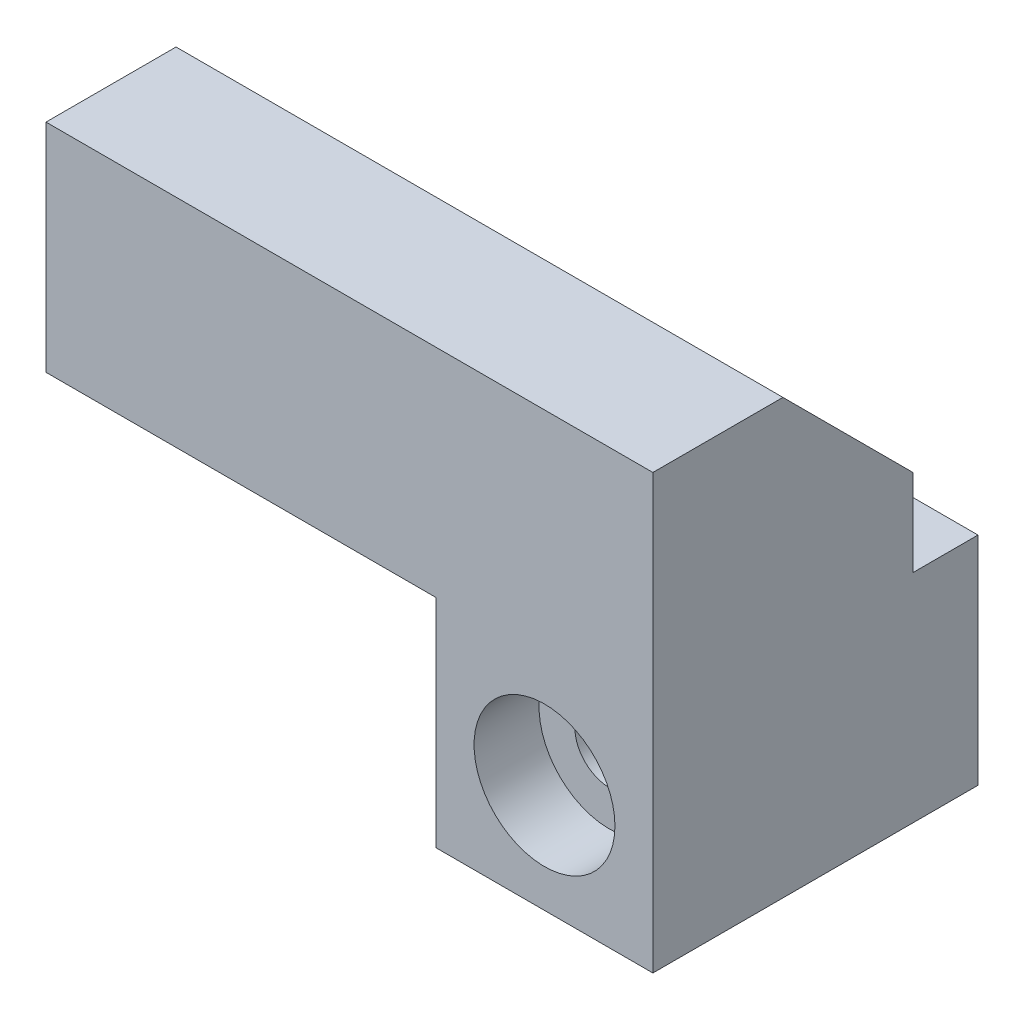
ISO-10303-21;
HEADER;
FILE_DESCRIPTION(('STEP AP214'),'2;1');
FILE_NAME('part.step','',(''),(''),'','','');
FILE_SCHEMA(('AUTOMOTIVE_DESIGN { 1 0 10303 214 1 1 1 1 }'));
ENDSEC;
DATA;
#1=APPLICATION_CONTEXT('core data for automotive mechanical design processes');
#2=APPLICATION_PROTOCOL_DEFINITION('international standard','automotive_design',2000,#1);
#3=PRODUCT_CONTEXT('',#1,'mechanical');
#4=PRODUCT('Part','Part','',(#3));
#5=PRODUCT_RELATED_PRODUCT_CATEGORY('part','',(#4));
#6=PRODUCT_DEFINITION_FORMATION('','',#4);
#7=PRODUCT_DEFINITION_CONTEXT('part definition',#1,'design');
#8=PRODUCT_DEFINITION('design','',#6,#7);
#9=PRODUCT_DEFINITION_SHAPE('','',#8);
#10=(LENGTH_UNIT() NAMED_UNIT(*) SI_UNIT(.MILLI.,.METRE.));
#11=(NAMED_UNIT(*) PLANE_ANGLE_UNIT() SI_UNIT($,.RADIAN.));
#12=(NAMED_UNIT(*) SI_UNIT($,.STERADIAN.) SOLID_ANGLE_UNIT());
#13=UNCERTAINTY_MEASURE_WITH_UNIT(LENGTH_MEASURE(1.E-05),#10,'distance_accuracy_value','');
#14=(GEOMETRIC_REPRESENTATION_CONTEXT(3) GLOBAL_UNCERTAINTY_ASSIGNED_CONTEXT((#13)) GLOBAL_UNIT_ASSIGNED_CONTEXT((#10,
#11,#12)) REPRESENTATION_CONTEXT('',''));
#15=CARTESIAN_POINT('',(0.,0.,0.));
#16=DIRECTION('',(0.,0.,1.));
#17=DIRECTION('',(1.,0.,0.));
#18=AXIS2_PLACEMENT_3D('',#15,#16,#17);
#19=CARTESIAN_POINT('',(-5.,-10.,0.));
#20=DIRECTION('',(0.,0.,1.));
#21=DIRECTION('',(1.,0.,0.));
#22=AXIS2_PLACEMENT_3D('',#19,#20,#21);
#23=CYLINDRICAL_SURFACE('',#22,1.6);
#24=CARTESIAN_POINT('',(-5.,-10.,-3.));
#25=DIRECTION('',(0.,0.,1.));
#26=DIRECTION('',(1.,0.,0.));
#27=AXIS2_PLACEMENT_3D('',#24,#25,#26);
#28=CIRCLE('',#27,1.6);
#29=CARTESIAN_POINT('',(-3.4,-10.,-3.));
#30=VERTEX_POINT('',#29);
#31=EDGE_CURVE('E235',#30,#30,#28,.T.);
#32=ORIENTED_EDGE('',*,*,#31,.T.);
#33=EDGE_LOOP('',(#32));
#34=FACE_BOUND('',#33,.T.);
#35=CARTESIAN_POINT('',(-5.,-10.,-11.));
#36=DIRECTION('',(0.,0.,-1.));
#37=DIRECTION('',(0.,1.,0.));
#38=AXIS2_PLACEMENT_3D('',#35,#36,#37);
#39=CIRCLE('',#38,1.6);
#40=CARTESIAN_POINT('',(-5.,-8.4,-11.));
#41=VERTEX_POINT('',#40);
#42=EDGE_CURVE('E36',#41,#41,#39,.F.);
#43=ORIENTED_EDGE('',*,*,#42,.F.);
#44=EDGE_LOOP('',(#43));
#45=FACE_BOUND('',#44,.T.);
#46=ADVANCED_FACE('F32',(#34,#45),#23,.F.);
#47=CARTESIAN_POINT('',(0.,5.,-12.));
#48=DIRECTION('',(0.,0.,1.));
#49=DIRECTION('',(1.,0.,0.));
#50=AXIS2_PLACEMENT_3D('',#47,#48,#49);
#51=PLANE('',#50);
#52=DIRECTION('',(1.,0.,0.));
#53=VECTOR('',#52,1.);
#54=CARTESIAN_POINT('',(0.,-5.,-12.));
#55=LINE('',#54,#53);
#56=CARTESIAN_POINT('',(-10.,-5.,-12.));
#57=VERTEX_POINT('',#56);
#58=CARTESIAN_POINT('',(0.,-5.,-12.));
#59=VERTEX_POINT('',#58);
#60=EDGE_CURVE('E57',#57,#59,#55,.T.);
#61=ORIENTED_EDGE('',*,*,#60,.F.);
#62=DIRECTION('',(0.,-1.,0.));
#63=VECTOR('',#62,1.);
#64=CARTESIAN_POINT('',(-10.,5.,-12.));
#65=LINE('',#64,#63);
#66=CARTESIAN_POINT('',(-10.,-1.00000000000002,-12.));
#67=VERTEX_POINT('',#66);
#68=EDGE_CURVE('E278',#67,#57,#65,.T.);
#69=ORIENTED_EDGE('',*,*,#68,.F.);
#70=DIRECTION('',(1.,0.,0.));
#71=VECTOR('',#70,1.);
#72=CARTESIAN_POINT('',(0.,-1.00000000000002,-12.));
#73=LINE('',#72,#71);
#74=CARTESIAN_POINT('',(0.,-1.00000000000002,-12.));
#75=VERTEX_POINT('',#74);
#76=EDGE_CURVE('E41',#67,#75,#73,.T.);
#77=ORIENTED_EDGE('',*,*,#76,.T.);
#78=DIRECTION('',(0.,-1.,0.));
#79=VECTOR('',#78,1.);
#80=CARTESIAN_POINT('',(0.,5.,-12.));
#81=LINE('',#80,#79);
#82=EDGE_CURVE('E217',#75,#59,#81,.T.);
#83=ORIENTED_EDGE('',*,*,#82,.T.);
#84=EDGE_LOOP('',(#61,#69,#77,#83));
#85=FACE_BOUND('',#84,.T.);
#86=ADVANCED_FACE('F336',(#85),#51,.F.);
#87=CARTESIAN_POINT('',(0.,-5.,0.));
#88=DIRECTION('',(0.,1.,0.));
#89=DIRECTION('',(0.,0.,1.));
#90=AXIS2_PLACEMENT_3D('',#87,#88,#89);
#91=PLANE('',#90);
#92=DIRECTION('',(0.,0.,-1.));
#93=VECTOR('',#92,1.);
#94=CARTESIAN_POINT('',(-10.,-5.,-12.));
#95=LINE('',#94,#93);
#96=CARTESIAN_POINT('',(-10.,-5.,0.));
#97=VERTEX_POINT('',#96);
#98=CARTESIAN_POINT('',(-10.,-5.,-6.));
#99=VERTEX_POINT('',#98);
#100=EDGE_CURVE('E239',#97,#99,#95,.T.);
#101=ORIENTED_EDGE('',*,*,#100,.F.);
#102=DIRECTION('',(1.,0.,0.));
#103=VECTOR('',#102,1.);
#104=CARTESIAN_POINT('',(0.,-5.,0.));
#105=LINE('',#104,#103);
#106=CARTESIAN_POINT('',(-28.,-5.,0.));
#107=VERTEX_POINT('',#106);
#108=EDGE_CURVE('E257',#107,#97,#105,.T.);
#109=ORIENTED_EDGE('',*,*,#108,.F.);
#110=DIRECTION('',(0.,0.,1.));
#111=VECTOR('',#110,1.);
#112=CARTESIAN_POINT('',(-28.,-5.,0.));
#113=LINE('',#112,#111);
#114=CARTESIAN_POINT('',(-28.,-5.,-6.));
#115=VERTEX_POINT('',#114);
#116=EDGE_CURVE('E264',#115,#107,#113,.T.);
#117=ORIENTED_EDGE('',*,*,#116,.F.);
#118=DIRECTION('',(-1.,0.,0.));
#119=VECTOR('',#118,1.);
#120=CARTESIAN_POINT('',(-28.,-5.,-6.));
#121=LINE('',#120,#119);
#122=EDGE_CURVE('E266',#99,#115,#121,.T.);
#123=ORIENTED_EDGE('',*,*,#122,.F.);
#124=EDGE_LOOP('',(#101,#109,#117,#123));
#125=FACE_BOUND('',#124,.T.);
#126=ADVANCED_FACE('F342',(#125),#91,.F.);
#127=CARTESIAN_POINT('',(0.,5.,0.));
#128=DIRECTION('',(-1.,0.,0.));
#129=DIRECTION('',(0.,0.,1.));
#130=AXIS2_PLACEMENT_3D('',#127,#128,#129);
#131=PLANE('',#130);
#132=ORIENTED_EDGE('',*,*,#82,.F.);
#133=DIRECTION('',(0.,0.707106781186549,0.707106781186546));
#134=VECTOR('',#133,1.);
#135=CARTESIAN_POINT('',(0.,5.,-6.));
#136=LINE('',#135,#134);
#137=CARTESIAN_POINT('',(0.,5.,-6.));
#138=VERTEX_POINT('',#137);
#139=EDGE_CURVE('E11',#75,#138,#136,.T.);
#140=ORIENTED_EDGE('',*,*,#139,.T.);
#141=DIRECTION('',(0.,0.,-1.));
#142=VECTOR('',#141,1.);
#143=CARTESIAN_POINT('',(0.,5.,0.));
#144=LINE('',#143,#142);
#145=CARTESIAN_POINT('',(0.,5.,0.));
#146=VERTEX_POINT('',#145);
#147=EDGE_CURVE('E253',#146,#138,#144,.T.);
#148=ORIENTED_EDGE('',*,*,#147,.F.);
#149=DIRECTION('',(0.,-1.,0.));
#150=VECTOR('',#149,1.);
#151=CARTESIAN_POINT('',(0.,5.,0.));
#152=LINE('',#151,#150);
#153=CARTESIAN_POINT('',(0.,-15.,0.));
#154=VERTEX_POINT('',#153);
#155=EDGE_CURVE('E263',#146,#154,#152,.T.);
#156=ORIENTED_EDGE('',*,*,#155,.T.);
#157=DIRECTION('',(0.,0.,1.));
#158=VECTOR('',#157,1.);
#159=CARTESIAN_POINT('',(0.,-15.,-12.));
#160=LINE('',#159,#158);
#161=CARTESIAN_POINT('',(0.,-15.,-15.));
#162=VERTEX_POINT('',#161);
#163=EDGE_CURVE('E244',#162,#154,#160,.T.);
#164=ORIENTED_EDGE('',*,*,#163,.F.);
#165=DIRECTION('',(0.,-1.,0.));
#166=VECTOR('',#165,1.);
#167=CARTESIAN_POINT('',(0.,-15.,-15.));
#168=LINE('',#167,#166);
#169=CARTESIAN_POINT('',(0.,-5.,-15.));
#170=VERTEX_POINT('',#169);
#171=EDGE_CURVE('E199',#170,#162,#168,.T.);
#172=ORIENTED_EDGE('',*,*,#171,.F.);
#173=DIRECTION('',(0.,0.,1.));
#174=VECTOR('',#173,1.);
#175=CARTESIAN_POINT('',(0.,-5.,-15.));
#176=LINE('',#175,#174);
#177=EDGE_CURVE('E209',#170,#59,#176,.T.);
#178=ORIENTED_EDGE('',*,*,#177,.T.);
#179=EDGE_LOOP('',(#132,#140,#148,#156,#164,#172,#178));
#180=FACE_BOUND('',#179,.T.);
#181=ADVANCED_FACE('F306',(#180),#131,.F.);
#182=CARTESIAN_POINT('',(-10.,5.,-12.));
#183=DIRECTION('',(1.,0.,0.));
#184=DIRECTION('',(0.,0.,-1.));
#185=AXIS2_PLACEMENT_3D('',#182,#183,#184);
#186=PLANE('',#185);
#187=DIRECTION('',(0.,-1.,0.));
#188=VECTOR('',#187,1.);
#189=CARTESIAN_POINT('',(-10.,5.,-6.));
#190=LINE('',#189,#188);
#191=CARTESIAN_POINT('',(-10.,5.,-6.));
#192=VERTEX_POINT('',#191);
#193=EDGE_CURVE('E275',#192,#99,#190,.T.);
#194=ORIENTED_EDGE('',*,*,#193,.F.);
#195=DIRECTION('',(0.,-0.707106781186549,-0.707106781186546));
#196=VECTOR('',#195,1.);
#197=CARTESIAN_POINT('',(-10.,5.,-6.));
#198=LINE('',#197,#196);
#199=EDGE_CURVE('E291',#192,#67,#198,.T.);
#200=ORIENTED_EDGE('',*,*,#199,.T.);
#201=ORIENTED_EDGE('',*,*,#68,.T.);
#202=DIRECTION('',(0.,0.,1.));
#203=VECTOR('',#202,1.);
#204=CARTESIAN_POINT('',(-10.,-5.,-15.));
#205=LINE('',#204,#203);
#206=CARTESIAN_POINT('',(-10.,-5.,-15.));
#207=VERTEX_POINT('',#206);
#208=EDGE_CURVE('E222',#207,#57,#205,.T.);
#209=ORIENTED_EDGE('',*,*,#208,.F.);
#210=DIRECTION('',(0.,1.,0.));
#211=VECTOR('',#210,1.);
#212=CARTESIAN_POINT('',(-10.,-15.,-15.));
#213=LINE('',#212,#211);
#214=CARTESIAN_POINT('',(-10.,-15.,-15.));
#215=VERTEX_POINT('',#214);
#216=EDGE_CURVE('E205',#215,#207,#213,.T.);
#217=ORIENTED_EDGE('',*,*,#216,.F.);
#218=DIRECTION('',(0.,0.,-1.));
#219=VECTOR('',#218,1.);
#220=CARTESIAN_POINT('',(-10.,-15.,-12.));
#221=LINE('',#220,#219);
#222=CARTESIAN_POINT('',(-10.,-15.,0.));
#223=VERTEX_POINT('',#222);
#224=EDGE_CURVE('E242',#223,#215,#221,.T.);
#225=ORIENTED_EDGE('',*,*,#224,.F.);
#226=DIRECTION('',(0.,1.,0.));
#227=VECTOR('',#226,1.);
#228=CARTESIAN_POINT('',(-10.,-15.,0.));
#229=LINE('',#228,#227);
#230=EDGE_CURVE('E249',#223,#97,#229,.T.);
#231=ORIENTED_EDGE('',*,*,#230,.T.);
#232=ORIENTED_EDGE('',*,*,#100,.T.);
#233=EDGE_LOOP('',(#194,#200,#201,#209,#217,#225,#231,#232));
#234=FACE_BOUND('',#233,.T.);
#235=ADVANCED_FACE('F319',(#234),#186,.F.);
#236=CARTESIAN_POINT('',(-28.,5.,-6.));
#237=DIRECTION('',(0.,0.,1.));
#238=DIRECTION('',(1.,0.,0.));
#239=AXIS2_PLACEMENT_3D('',#236,#237,#238);
#240=PLANE('',#239);
#241=ORIENTED_EDGE('',*,*,#122,.T.);
#242=DIRECTION('',(0.,-1.,0.));
#243=VECTOR('',#242,1.);
#244=CARTESIAN_POINT('',(-28.,5.,-6.));
#245=LINE('',#244,#243);
#246=CARTESIAN_POINT('',(-28.,5.,-6.));
#247=VERTEX_POINT('',#246);
#248=EDGE_CURVE('E279',#247,#115,#245,.T.);
#249=ORIENTED_EDGE('',*,*,#248,.F.);
#250=DIRECTION('',(-1.,0.,0.));
#251=VECTOR('',#250,1.);
#252=CARTESIAN_POINT('',(-28.,5.,-6.));
#253=LINE('',#252,#251);
#254=EDGE_CURVE('E256',#192,#247,#253,.T.);
#255=ORIENTED_EDGE('',*,*,#254,.F.);
#256=ORIENTED_EDGE('',*,*,#193,.T.);
#257=EDGE_LOOP('',(#241,#249,#255,#256));
#258=FACE_BOUND('',#257,.T.);
#259=ADVANCED_FACE('F363',(#258),#240,.F.);
#260=CARTESIAN_POINT('',(-28.,5.,0.));
#261=DIRECTION('',(1.,0.,0.));
#262=DIRECTION('',(0.,0.,-1.));
#263=AXIS2_PLACEMENT_3D('',#260,#261,#262);
#264=PLANE('',#263);
#265=ORIENTED_EDGE('',*,*,#116,.T.);
#266=DIRECTION('',(0.,-1.,0.));
#267=VECTOR('',#266,1.);
#268=CARTESIAN_POINT('',(-28.,5.,0.));
#269=LINE('',#268,#267);
#270=CARTESIAN_POINT('',(-28.,5.,0.));
#271=VERTEX_POINT('',#270);
#272=EDGE_CURVE('E296',#271,#107,#269,.T.);
#273=ORIENTED_EDGE('',*,*,#272,.F.);
#274=DIRECTION('',(0.,0.,1.));
#275=VECTOR('',#274,1.);
#276=CARTESIAN_POINT('',(-28.,5.,0.));
#277=LINE('',#276,#275);
#278=EDGE_CURVE('E259',#247,#271,#277,.T.);
#279=ORIENTED_EDGE('',*,*,#278,.F.);
#280=ORIENTED_EDGE('',*,*,#248,.T.);
#281=EDGE_LOOP('',(#265,#273,#279,#280));
#282=FACE_BOUND('',#281,.T.);
#283=ADVANCED_FACE('F359',(#282),#264,.F.);
#284=CARTESIAN_POINT('',(0.,5.,0.));
#285=DIRECTION('',(0.,0.,-1.));
#286=DIRECTION('',(-1.,0.,0.));
#287=AXIS2_PLACEMENT_3D('',#284,#285,#286);
#288=PLANE('',#287);
#289=CARTESIAN_POINT('',(-5.,-10.,0.));
#290=DIRECTION('',(0.,0.,1.));
#291=DIRECTION('',(1.,0.,0.));
#292=AXIS2_PLACEMENT_3D('',#289,#290,#291);
#293=CIRCLE('',#292,3.25);
#294=CARTESIAN_POINT('',(-1.75000000000001,-10.,0.));
#295=VERTEX_POINT('',#294);
#296=EDGE_CURVE('E212',#295,#295,#293,.T.);
#297=ORIENTED_EDGE('',*,*,#296,.F.);
#298=EDGE_LOOP('',(#297));
#299=FACE_BOUND('',#298,.T.);
#300=ORIENTED_EDGE('',*,*,#108,.T.);
#301=ORIENTED_EDGE('',*,*,#230,.F.);
#302=DIRECTION('',(-1.,0.,0.));
#303=VECTOR('',#302,1.);
#304=CARTESIAN_POINT('',(-10.,-15.,0.));
#305=LINE('',#304,#303);
#306=EDGE_CURVE('E247',#154,#223,#305,.T.);
#307=ORIENTED_EDGE('',*,*,#306,.F.);
#308=ORIENTED_EDGE('',*,*,#155,.F.);
#309=DIRECTION('',(1.,0.,0.));
#310=VECTOR('',#309,1.);
#311=CARTESIAN_POINT('',(0.,5.,0.));
#312=LINE('',#311,#310);
#313=EDGE_CURVE('E261',#271,#146,#312,.T.);
#314=ORIENTED_EDGE('',*,*,#313,.F.);
#315=ORIENTED_EDGE('',*,*,#272,.T.);
#316=EDGE_LOOP('',(#300,#301,#307,#308,#314,#315));
#317=FACE_BOUND('',#316,.T.);
#318=ADVANCED_FACE('F313',(#299,#317),#288,.F.);
#319=CARTESIAN_POINT('',(0.,5.,0.));
#320=DIRECTION('',(0.,1.,0.));
#321=DIRECTION('',(0.,0.,1.));
#322=AXIS2_PLACEMENT_3D('',#319,#320,#321);
#323=PLANE('',#322);
#324=ORIENTED_EDGE('',*,*,#147,.T.);
#325=DIRECTION('',(-1.,0.,0.));
#326=VECTOR('',#325,1.);
#327=CARTESIAN_POINT('',(-10.,5.,-6.));
#328=LINE('',#327,#326);
#329=EDGE_CURVE('E288',#138,#192,#328,.T.);
#330=ORIENTED_EDGE('',*,*,#329,.T.);
#331=ORIENTED_EDGE('',*,*,#254,.T.);
#332=ORIENTED_EDGE('',*,*,#278,.T.);
#333=ORIENTED_EDGE('',*,*,#313,.T.);
#334=EDGE_LOOP('',(#324,#330,#331,#332,#333));
#335=FACE_BOUND('',#334,.T.);
#336=ADVANCED_FACE('F350',(#335),#323,.T.);
#337=CARTESIAN_POINT('',(0.,-15.,0.));
#338=DIRECTION('',(0.,1.,0.));
#339=DIRECTION('',(0.,0.,1.));
#340=AXIS2_PLACEMENT_3D('',#337,#338,#339);
#341=PLANE('',#340);
#342=ORIENTED_EDGE('',*,*,#224,.T.);
#343=DIRECTION('',(-1.,0.,0.));
#344=VECTOR('',#343,1.);
#345=CARTESIAN_POINT('',(0.,-15.,-15.));
#346=LINE('',#345,#344);
#347=EDGE_CURVE('E202',#162,#215,#346,.T.);
#348=ORIENTED_EDGE('',*,*,#347,.F.);
#349=ORIENTED_EDGE('',*,*,#163,.T.);
#350=ORIENTED_EDGE('',*,*,#306,.T.);
#351=EDGE_LOOP('',(#342,#348,#349,#350));
#352=FACE_BOUND('',#351,.T.);
#353=ADVANCED_FACE('F311',(#352),#341,.F.);
#354=CARTESIAN_POINT('',(-3.4,-10.,-3.));
#355=DIRECTION('',(0.,0.,-1.));
#356=DIRECTION('',(-1.,0.,0.));
#357=AXIS2_PLACEMENT_3D('',#354,#355,#356);
#358=PLANE('',#357);
#359=ORIENTED_EDGE('',*,*,#31,.F.);
#360=EDGE_LOOP('',(#359));
#361=FACE_BOUND('',#360,.T.);
#362=CARTESIAN_POINT('',(-5.,-10.,-3.));
#363=DIRECTION('',(0.,0.,1.));
#364=DIRECTION('',(1.,0.,0.));
#365=AXIS2_PLACEMENT_3D('',#362,#363,#364);
#366=CIRCLE('',#365,3.25);
#367=CARTESIAN_POINT('',(-1.75,-10.,-3.));
#368=VERTEX_POINT('',#367);
#369=EDGE_CURVE('E231',#368,#368,#366,.T.);
#370=ORIENTED_EDGE('',*,*,#369,.T.);
#371=EDGE_LOOP('',(#370));
#372=FACE_BOUND('',#371,.T.);
#373=ADVANCED_FACE('F347',(#361,#372),#358,.F.);
#374=CARTESIAN_POINT('',(-5.,-10.,0.));
#375=DIRECTION('',(0.,0.,1.));
#376=DIRECTION('',(1.,0.,0.));
#377=AXIS2_PLACEMENT_3D('',#374,#375,#376);
#378=CYLINDRICAL_SURFACE('',#377,3.25);
#379=ORIENTED_EDGE('',*,*,#369,.F.);
#380=EDGE_LOOP('',(#379));
#381=FACE_BOUND('',#380,.T.);
#382=ORIENTED_EDGE('',*,*,#296,.T.);
#383=EDGE_LOOP('',(#382));
#384=FACE_BOUND('',#383,.T.);
#385=ADVANCED_FACE('F407',(#381,#384),#378,.F.);
#386=CARTESIAN_POINT('',(0.,5.,-6.));
#387=DIRECTION('',(0.,0.707106781186546,-0.707106781186549));
#388=DIRECTION('',(1.,0.,0.));
#389=AXIS2_PLACEMENT_3D('',#386,#387,#388);
#390=PLANE('',#389);
#391=ORIENTED_EDGE('',*,*,#139,.F.);
#392=ORIENTED_EDGE('',*,*,#76,.F.);
#393=ORIENTED_EDGE('',*,*,#199,.F.);
#394=ORIENTED_EDGE('',*,*,#329,.F.);
#395=EDGE_LOOP('',(#391,#392,#393,#394));
#396=FACE_BOUND('',#395,.T.);
#397=ADVANCED_FACE('F34',(#396),#390,.T.);
#398=CARTESIAN_POINT('',(0.,0.,-15.));
#399=DIRECTION('',(0.,0.,1.));
#400=DIRECTION('',(1.,0.,0.));
#401=AXIS2_PLACEMENT_3D('',#398,#399,#400);
#402=PLANE('',#401);
#403=DIRECTION('',(-0.866025403784439,0.5,0.));
#404=VECTOR('',#403,1.);
#405=CARTESIAN_POINT('',(-5.,-13.2331615074619,-15.));
#406=LINE('',#405,#404);
#407=CARTESIAN_POINT('',(-5.,-13.2331615074619,-15.));
#408=VERTEX_POINT('',#407);
#409=CARTESIAN_POINT('',(-7.8,-11.616580753731,-15.));
#410=VERTEX_POINT('',#409);
#411=EDGE_CURVE('E180',#408,#410,#406,.T.);
#412=ORIENTED_EDGE('',*,*,#411,.F.);
#413=DIRECTION('',(-0.866025403784439,-0.5,0.));
#414=VECTOR('',#413,1.);
#415=CARTESIAN_POINT('',(-2.2,-11.616580753731,-15.));
#416=LINE('',#415,#414);
#417=CARTESIAN_POINT('',(-2.2,-11.616580753731,-15.));
#418=VERTEX_POINT('',#417);
#419=EDGE_CURVE('E49',#418,#408,#416,.T.);
#420=ORIENTED_EDGE('',*,*,#419,.F.);
#421=DIRECTION('',(0.,-1.,0.));
#422=VECTOR('',#421,1.);
#423=CARTESIAN_POINT('',(-2.2,-8.38341924626904,-15.));
#424=LINE('',#423,#422);
#425=CARTESIAN_POINT('',(-2.2,-8.38341924626904,-15.));
#426=VERTEX_POINT('',#425);
#427=EDGE_CURVE('E166',#426,#418,#424,.T.);
#428=ORIENTED_EDGE('',*,*,#427,.F.);
#429=DIRECTION('',(0.866025403784439,-0.5,0.));
#430=VECTOR('',#429,1.);
#431=CARTESIAN_POINT('',(-5.,-6.76683849253809,-15.));
#432=LINE('',#431,#430);
#433=CARTESIAN_POINT('',(-5.,-6.76683849253809,-15.));
#434=VERTEX_POINT('',#433);
#435=EDGE_CURVE('E169',#434,#426,#432,.T.);
#436=ORIENTED_EDGE('',*,*,#435,.F.);
#437=DIRECTION('',(0.866025403784439,0.5,0.));
#438=VECTOR('',#437,1.);
#439=CARTESIAN_POINT('',(-7.8,-8.38341924626905,-15.));
#440=LINE('',#439,#438);
#441=CARTESIAN_POINT('',(-7.8,-8.38341924626905,-15.));
#442=VERTEX_POINT('',#441);
#443=EDGE_CURVE('E185',#442,#434,#440,.T.);
#444=ORIENTED_EDGE('',*,*,#443,.F.);
#445=DIRECTION('',(0.,1.,0.));
#446=VECTOR('',#445,1.);
#447=CARTESIAN_POINT('',(-7.8,-11.616580753731,-15.));
#448=LINE('',#447,#446);
#449=EDGE_CURVE('E182',#410,#442,#448,.T.);
#450=ORIENTED_EDGE('',*,*,#449,.F.);
#451=EDGE_LOOP('',(#412,#420,#428,#436,#444,#450));
#452=FACE_BOUND('',#451,.T.);
#453=ORIENTED_EDGE('',*,*,#171,.T.);
#454=ORIENTED_EDGE('',*,*,#347,.T.);
#455=ORIENTED_EDGE('',*,*,#216,.T.);
#456=DIRECTION('',(1.,0.,0.));
#457=VECTOR('',#456,1.);
#458=CARTESIAN_POINT('',(0.,-5.,-15.));
#459=LINE('',#458,#457);
#460=EDGE_CURVE('E207',#207,#170,#459,.T.);
#461=ORIENTED_EDGE('',*,*,#460,.T.);
#462=EDGE_LOOP('',(#453,#454,#455,#461));
#463=FACE_BOUND('',#462,.T.);
#464=ADVANCED_FACE('F321',(#452,#463),#402,.F.);
#465=CARTESIAN_POINT('',(0.,-5.,-15.));
#466=DIRECTION('',(0.,-1.,0.));
#467=DIRECTION('',(0.,0.,-1.));
#468=AXIS2_PLACEMENT_3D('',#465,#466,#467);
#469=PLANE('',#468);
#470=ORIENTED_EDGE('',*,*,#60,.T.);
#471=ORIENTED_EDGE('',*,*,#177,.F.);
#472=ORIENTED_EDGE('',*,*,#460,.F.);
#473=ORIENTED_EDGE('',*,*,#208,.T.);
#474=EDGE_LOOP('',(#470,#471,#472,#473));
#475=FACE_BOUND('',#474,.T.);
#476=ADVANCED_FACE('F324',(#475),#469,.F.);
#477=CARTESIAN_POINT('',(0.,0.,-11.));
#478=DIRECTION('',(0.,0.,-1.));
#479=DIRECTION('',(0.,1.,0.));
#480=AXIS2_PLACEMENT_3D('',#477,#478,#479);
#481=PLANE('',#480);
#482=DIRECTION('',(-0.866025403784439,-0.5,0.));
#483=VECTOR('',#482,1.);
#484=CARTESIAN_POINT('',(-2.2,-11.616580753731,-11.));
#485=LINE('',#484,#483);
#486=CARTESIAN_POINT('',(-2.2,-11.616580753731,-11.));
#487=VERTEX_POINT('',#486);
#488=CARTESIAN_POINT('',(-5.,-13.2331615074619,-11.));
#489=VERTEX_POINT('',#488);
#490=EDGE_CURVE('E146',#487,#489,#485,.T.);
#491=ORIENTED_EDGE('',*,*,#490,.T.);
#492=DIRECTION('',(-0.866025403784439,0.5,0.));
#493=VECTOR('',#492,1.);
#494=CARTESIAN_POINT('',(-5.,-13.2331615074619,-11.));
#495=LINE('',#494,#493);
#496=CARTESIAN_POINT('',(-7.8,-11.616580753731,-11.));
#497=VERTEX_POINT('',#496);
#498=EDGE_CURVE('E155',#489,#497,#495,.T.);
#499=ORIENTED_EDGE('',*,*,#498,.T.);
#500=DIRECTION('',(0.,1.,0.));
#501=VECTOR('',#500,1.);
#502=CARTESIAN_POINT('',(-7.8,-11.616580753731,-11.));
#503=LINE('',#502,#501);
#504=CARTESIAN_POINT('',(-7.8,-8.38341924626905,-11.));
#505=VERTEX_POINT('',#504);
#506=EDGE_CURVE('E160',#497,#505,#503,.T.);
#507=ORIENTED_EDGE('',*,*,#506,.T.);
#508=DIRECTION('',(0.866025403784439,0.5,0.));
#509=VECTOR('',#508,1.);
#510=CARTESIAN_POINT('',(-7.8,-8.38341924626905,-11.));
#511=LINE('',#510,#509);
#512=CARTESIAN_POINT('',(-5.,-6.76683849253809,-11.));
#513=VERTEX_POINT('',#512);
#514=EDGE_CURVE('E173',#505,#513,#511,.T.);
#515=ORIENTED_EDGE('',*,*,#514,.T.);
#516=DIRECTION('',(0.866025403784439,-0.5,0.));
#517=VECTOR('',#516,1.);
#518=CARTESIAN_POINT('',(-5.,-6.76683849253809,-11.));
#519=LINE('',#518,#517);
#520=CARTESIAN_POINT('',(-2.2,-8.38341924626904,-11.));
#521=VERTEX_POINT('',#520);
#522=EDGE_CURVE('E176',#513,#521,#519,.T.);
#523=ORIENTED_EDGE('',*,*,#522,.T.);
#524=DIRECTION('',(0.,-1.,0.));
#525=VECTOR('',#524,1.);
#526=CARTESIAN_POINT('',(-2.2,-8.38341924626904,-11.));
#527=LINE('',#526,#525);
#528=EDGE_CURVE('E152',#521,#487,#527,.T.);
#529=ORIENTED_EDGE('',*,*,#528,.T.);
#530=EDGE_LOOP('',(#491,#499,#507,#515,#523,#529));
#531=FACE_BOUND('',#530,.T.);
#532=ORIENTED_EDGE('',*,*,#42,.T.);
#533=EDGE_LOOP('',(#532));
#534=FACE_BOUND('',#533,.T.);
#535=ADVANCED_FACE('F162',(#531,#534),#481,.T.);
#536=CARTESIAN_POINT('',(-2.2,-11.616580753731,-11.));
#537=DIRECTION('',(0.5,-0.866025403784439,0.));
#538=DIRECTION('',(0.866025403784439,0.5,0.));
#539=AXIS2_PLACEMENT_3D('',#536,#537,#538);
#540=PLANE('',#539);
#541=ORIENTED_EDGE('',*,*,#419,.T.);
#542=DIRECTION('',(0.,0.,-1.));
#543=VECTOR('',#542,1.);
#544=CARTESIAN_POINT('',(-5.,-13.2331615074619,-11.));
#545=LINE('',#544,#543);
#546=EDGE_CURVE('E142',#489,#408,#545,.T.);
#547=ORIENTED_EDGE('',*,*,#546,.F.);
#548=ORIENTED_EDGE('',*,*,#490,.F.);
#549=DIRECTION('',(0.,0.,-1.));
#550=VECTOR('',#549,1.);
#551=CARTESIAN_POINT('',(-2.2,-11.616580753731,-11.));
#552=LINE('',#551,#550);
#553=EDGE_CURVE('E190',#487,#418,#552,.T.);
#554=ORIENTED_EDGE('',*,*,#553,.T.);
#555=EDGE_LOOP('',(#541,#547,#548,#554));
#556=FACE_BOUND('',#555,.T.);
#557=ADVANCED_FACE('F144',(#556),#540,.F.);
#558=CARTESIAN_POINT('',(-2.2,-8.38341924626904,-11.));
#559=DIRECTION('',(1.,0.,0.));
#560=DIRECTION('',(0.,0.,-1.));
#561=AXIS2_PLACEMENT_3D('',#558,#559,#560);
#562=PLANE('',#561);
#563=ORIENTED_EDGE('',*,*,#427,.T.);
#564=ORIENTED_EDGE('',*,*,#553,.F.);
#565=ORIENTED_EDGE('',*,*,#528,.F.);
#566=DIRECTION('',(0.,0.,-1.));
#567=VECTOR('',#566,1.);
#568=CARTESIAN_POINT('',(-2.2,-8.38341924626904,-11.));
#569=LINE('',#568,#567);
#570=EDGE_CURVE('E192',#521,#426,#569,.T.);
#571=ORIENTED_EDGE('',*,*,#570,.T.);
#572=EDGE_LOOP('',(#563,#564,#565,#571));
#573=FACE_BOUND('',#572,.T.);
#574=ADVANCED_FACE('F440',(#573),#562,.F.);
#575=CARTESIAN_POINT('',(-5.,-6.76683849253809,-11.));
#576=DIRECTION('',(0.5,0.866025403784439,0.));
#577=DIRECTION('',(-0.866025403784439,0.5,0.));
#578=AXIS2_PLACEMENT_3D('',#575,#576,#577);
#579=PLANE('',#578);
#580=ORIENTED_EDGE('',*,*,#435,.T.);
#581=ORIENTED_EDGE('',*,*,#570,.F.);
#582=ORIENTED_EDGE('',*,*,#522,.F.);
#583=DIRECTION('',(0.,0.,-1.));
#584=VECTOR('',#583,1.);
#585=CARTESIAN_POINT('',(-5.,-6.76683849253809,-11.));
#586=LINE('',#585,#584);
#587=EDGE_CURVE('E194',#513,#434,#586,.T.);
#588=ORIENTED_EDGE('',*,*,#587,.T.);
#589=EDGE_LOOP('',(#580,#581,#582,#588));
#590=FACE_BOUND('',#589,.T.);
#591=ADVANCED_FACE('F449',(#590),#579,.F.);
#592=CARTESIAN_POINT('',(-7.8,-8.38341924626905,-11.));
#593=DIRECTION('',(-0.5,0.866025403784439,0.));
#594=DIRECTION('',(-0.866025403784439,-0.5,0.));
#595=AXIS2_PLACEMENT_3D('',#592,#593,#594);
#596=PLANE('',#595);
#597=ORIENTED_EDGE('',*,*,#443,.T.);
#598=ORIENTED_EDGE('',*,*,#587,.F.);
#599=ORIENTED_EDGE('',*,*,#514,.F.);
#600=DIRECTION('',(0.,0.,-1.));
#601=VECTOR('',#600,1.);
#602=CARTESIAN_POINT('',(-7.8,-8.38341924626905,-11.));
#603=LINE('',#602,#601);
#604=EDGE_CURVE('E196',#505,#442,#603,.T.);
#605=ORIENTED_EDGE('',*,*,#604,.T.);
#606=EDGE_LOOP('',(#597,#598,#599,#605));
#607=FACE_BOUND('',#606,.T.);
#608=ADVANCED_FACE('F459',(#607),#596,.F.);
#609=CARTESIAN_POINT('',(-7.8,-11.616580753731,-11.));
#610=DIRECTION('',(-1.,0.,0.));
#611=DIRECTION('',(0.,-1.,0.));
#612=AXIS2_PLACEMENT_3D('',#609,#610,#611);
#613=PLANE('',#612);
#614=ORIENTED_EDGE('',*,*,#449,.T.);
#615=ORIENTED_EDGE('',*,*,#604,.F.);
#616=ORIENTED_EDGE('',*,*,#506,.F.);
#617=DIRECTION('',(0.,0.,-1.));
#618=VECTOR('',#617,1.);
#619=CARTESIAN_POINT('',(-7.8,-11.616580753731,-11.));
#620=LINE('',#619,#618);
#621=EDGE_CURVE('E151',#497,#410,#620,.T.);
#622=ORIENTED_EDGE('',*,*,#621,.T.);
#623=EDGE_LOOP('',(#614,#615,#616,#622));
#624=FACE_BOUND('',#623,.T.);
#625=ADVANCED_FACE('F469',(#624),#613,.F.);
#626=CARTESIAN_POINT('',(-5.,-13.2331615074619,-11.));
#627=DIRECTION('',(-0.5,-0.866025403784439,0.));
#628=DIRECTION('',(0.866025403784439,-0.5,0.));
#629=AXIS2_PLACEMENT_3D('',#626,#627,#628);
#630=PLANE('',#629);
#631=ORIENTED_EDGE('',*,*,#411,.T.);
#632=ORIENTED_EDGE('',*,*,#621,.F.);
#633=ORIENTED_EDGE('',*,*,#498,.F.);
#634=ORIENTED_EDGE('',*,*,#546,.T.);
#635=EDGE_LOOP('',(#631,#632,#633,#634));
#636=FACE_BOUND('',#635,.T.);
#637=ADVANCED_FACE('F156',(#636),#630,.F.);
#638=CLOSED_SHELL('',(#46,#86,#126,#181,#235,#259,#283,#318,#336,#353,#373,#385,#397,#464,#476,
#535,#557,#574,#591,#608,#625,#637));
#639=MANIFOLD_SOLID_BREP('B2',#638);
#640=ADVANCED_BREP_SHAPE_REPRESENTATION('',(#18,#639),#14);
#641=SHAPE_DEFINITION_REPRESENTATION(#9,#640);
ENDSEC;
END-ISO-10303-21;
